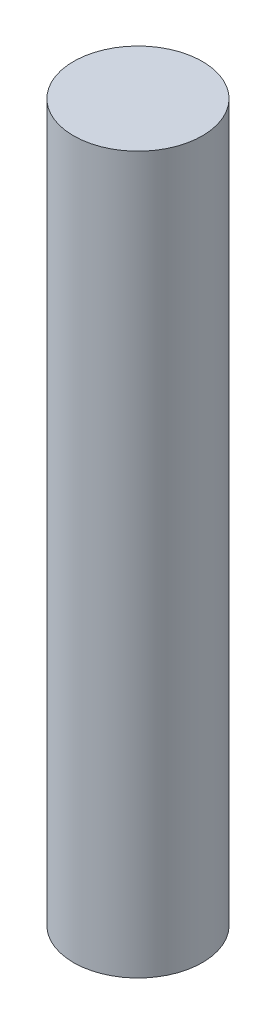
ISO-10303-21;
HEADER;
FILE_DESCRIPTION(('STEP AP214'),'2;1');
FILE_NAME('part.step','',(''),(''),'','','');
FILE_SCHEMA(('AUTOMOTIVE_DESIGN { 1 0 10303 214 1 1 1 1 }'));
ENDSEC;
DATA;
#1=APPLICATION_CONTEXT('core data for automotive mechanical design processes');
#2=APPLICATION_PROTOCOL_DEFINITION('international standard','automotive_design',2000,#1);
#3=PRODUCT_CONTEXT('',#1,'mechanical');
#4=PRODUCT('Part','Part','',(#3));
#5=PRODUCT_RELATED_PRODUCT_CATEGORY('part','',(#4));
#6=PRODUCT_DEFINITION_FORMATION('','',#4);
#7=PRODUCT_DEFINITION_CONTEXT('part definition',#1,'design');
#8=PRODUCT_DEFINITION('design','',#6,#7);
#9=PRODUCT_DEFINITION_SHAPE('','',#8);
#10=(LENGTH_UNIT() NAMED_UNIT(*) SI_UNIT(.MILLI.,.METRE.));
#11=(NAMED_UNIT(*) PLANE_ANGLE_UNIT() SI_UNIT($,.RADIAN.));
#12=(NAMED_UNIT(*) SI_UNIT($,.STERADIAN.) SOLID_ANGLE_UNIT());
#13=UNCERTAINTY_MEASURE_WITH_UNIT(LENGTH_MEASURE(1.E-05),#10,'distance_accuracy_value','');
#14=(GEOMETRIC_REPRESENTATION_CONTEXT(3) GLOBAL_UNCERTAINTY_ASSIGNED_CONTEXT((#13)) GLOBAL_UNIT_ASSIGNED_CONTEXT((#10,
#11,#12)) REPRESENTATION_CONTEXT('',''));
#15=CARTESIAN_POINT('',(0.,0.,0.));
#16=DIRECTION('',(0.,0.,1.));
#17=DIRECTION('',(1.,0.,0.));
#18=AXIS2_PLACEMENT_3D('',#15,#16,#17);
#19=CARTESIAN_POINT('',(0.,50.,0.));
#20=DIRECTION('',(0.,-1.,0.));
#21=DIRECTION('',(0.,0.,-1.));
#22=AXIS2_PLACEMENT_3D('',#19,#20,#21);
#23=CYLINDRICAL_SURFACE('',#22,4.5);
#24=CARTESIAN_POINT('',(0.,50.,0.));
#25=DIRECTION('',(0.,1.,0.));
#26=DIRECTION('',(0.,0.,1.));
#27=AXIS2_PLACEMENT_3D('',#24,#25,#26);
#28=CIRCLE('',#27,4.5);
#29=CARTESIAN_POINT('',(0.,50.,4.5));
#30=VERTEX_POINT('',#29);
#31=EDGE_CURVE('E10',#30,#30,#28,.T.);
#32=ORIENTED_EDGE('',*,*,#31,.F.);
#33=EDGE_LOOP('',(#32));
#34=FACE_BOUND('',#33,.T.);
#35=CARTESIAN_POINT('',(0.,0.,0.));
#36=DIRECTION('',(0.,1.,0.));
#37=DIRECTION('',(0.,0.,1.));
#38=AXIS2_PLACEMENT_3D('',#35,#36,#37);
#39=CIRCLE('',#38,4.5);
#40=CARTESIAN_POINT('',(0.,0.,4.5));
#41=VERTEX_POINT('',#40);
#42=EDGE_CURVE('E18',#41,#41,#39,.T.);
#43=ORIENTED_EDGE('',*,*,#42,.T.);
#44=EDGE_LOOP('',(#43));
#45=FACE_BOUND('',#44,.T.);
#46=ADVANCED_FACE('F15',(#34,#45),#23,.T.);
#47=CARTESIAN_POINT('',(0.,50.,0.));
#48=DIRECTION('',(0.,1.,0.));
#49=DIRECTION('',(0.,0.,1.));
#50=AXIS2_PLACEMENT_3D('',#47,#48,#49);
#51=PLANE('',#50);
#52=ORIENTED_EDGE('',*,*,#31,.T.);
#53=EDGE_LOOP('',(#52));
#54=FACE_BOUND('',#53,.T.);
#55=ADVANCED_FACE('F30',(#54),#51,.T.);
#56=CARTESIAN_POINT('',(0.,0.,0.));
#57=DIRECTION('',(0.,1.,0.));
#58=DIRECTION('',(0.,0.,1.));
#59=AXIS2_PLACEMENT_3D('',#56,#57,#58);
#60=PLANE('',#59);
#61=ORIENTED_EDGE('',*,*,#42,.F.);
#62=EDGE_LOOP('',(#61));
#63=FACE_BOUND('',#62,.T.);
#64=ADVANCED_FACE('F28',(#63),#60,.F.);
#65=CLOSED_SHELL('',(#46,#55,#64));
#66=MANIFOLD_SOLID_BREP('B1',#65);
#67=ADVANCED_BREP_SHAPE_REPRESENTATION('',(#18,#66),#14);
#68=SHAPE_DEFINITION_REPRESENTATION(#9,#67);
ENDSEC;
END-ISO-10303-21;
